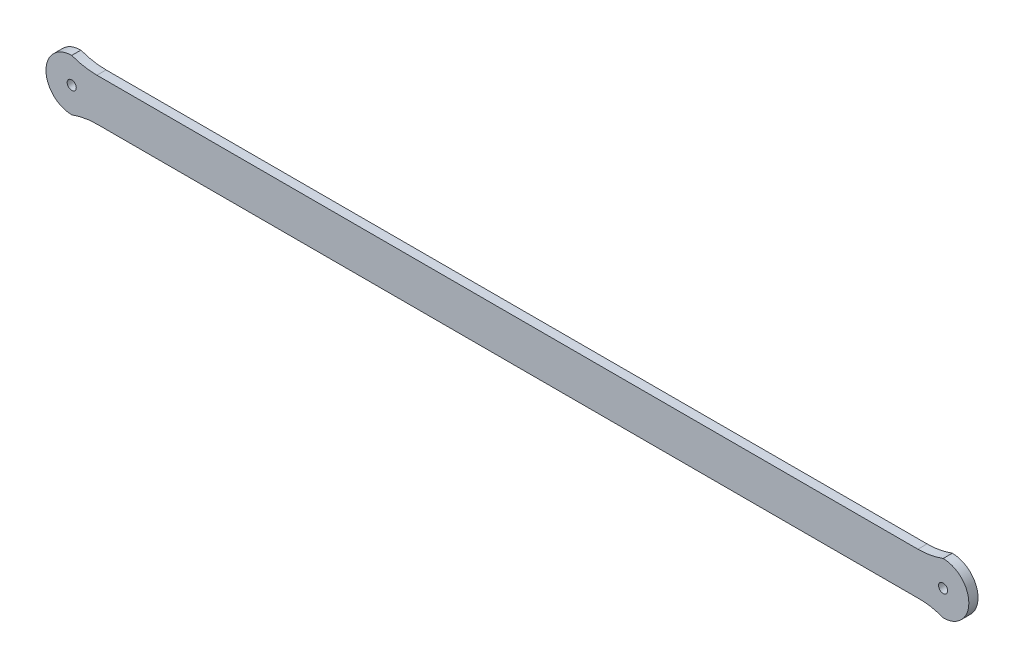
ISO-10303-21;
HEADER;
FILE_DESCRIPTION(('STEP AP214'),'2;1');
FILE_NAME('part.step','',(''),(''),'','','');
FILE_SCHEMA(('AUTOMOTIVE_DESIGN { 1 0 10303 214 1 1 1 1 }'));
ENDSEC;
DATA;
#1=APPLICATION_CONTEXT('core data for automotive mechanical design processes');
#2=APPLICATION_PROTOCOL_DEFINITION('international standard','automotive_design',2000,#1);
#3=PRODUCT_CONTEXT('',#1,'mechanical');
#4=PRODUCT('Part','Part','',(#3));
#5=PRODUCT_RELATED_PRODUCT_CATEGORY('part','',(#4));
#6=PRODUCT_DEFINITION_FORMATION('','',#4);
#7=PRODUCT_DEFINITION_CONTEXT('part definition',#1,'design');
#8=PRODUCT_DEFINITION('design','',#6,#7);
#9=PRODUCT_DEFINITION_SHAPE('','',#8);
#10=(LENGTH_UNIT() NAMED_UNIT(*) SI_UNIT(.MILLI.,.METRE.));
#11=(NAMED_UNIT(*) PLANE_ANGLE_UNIT() SI_UNIT($,.RADIAN.));
#12=(NAMED_UNIT(*) SI_UNIT($,.STERADIAN.) SOLID_ANGLE_UNIT());
#13=UNCERTAINTY_MEASURE_WITH_UNIT(LENGTH_MEASURE(1.E-05),#10,'distance_accuracy_value','');
#14=(GEOMETRIC_REPRESENTATION_CONTEXT(3) GLOBAL_UNCERTAINTY_ASSIGNED_CONTEXT((#13)) GLOBAL_UNIT_ASSIGNED_CONTEXT((#10,
#11,#12)) REPRESENTATION_CONTEXT('',''));
#15=CARTESIAN_POINT('',(0.,0.,0.));
#16=DIRECTION('',(0.,0.,1.));
#17=DIRECTION('',(1.,0.,0.));
#18=AXIS2_PLACEMENT_3D('',#15,#16,#17);
#19=CARTESIAN_POINT('',(-143.274111577399,32.5440909398075,1.6));
#20=DIRECTION('',(0.,0.,1.));
#21=DIRECTION('',(1.,0.,0.));
#22=AXIS2_PLACEMENT_3D('',#19,#20,#21);
#23=PLANE('',#22);
#24=CARTESIAN_POINT('',(-152.069999984504,8.58315293839063E-08,1.6));
#25=DIRECTION('',(0.,0.,1.));
#26=DIRECTION('',(1.,0.,0.));
#27=AXIS2_PLACEMENT_3D('',#24,#25,#26);
#28=CIRCLE('',#27,1.58750000000007);
#29=CARTESIAN_POINT('',(-150.482499984504,8.58315293839063E-08,1.6));
#30=VERTEX_POINT('',#29);
#31=EDGE_CURVE('E134',#30,#30,#28,.T.);
#32=ORIENTED_EDGE('',*,*,#31,.F.);
#33=EDGE_LOOP('',(#32));
#34=FACE_BOUND('',#33,.T.);
#35=CARTESIAN_POINT('',(-143.274111577399,32.5440909398075,1.6));
#36=DIRECTION('',(0.,0.,-1.));
#37=DIRECTION('',(1.,0.,0.));
#38=AXIS2_PLACEMENT_3D('',#35,#36,#37);
#39=CIRCLE('',#38,25.1540909398073);
#40=CARTESIAN_POINT('',(-143.274111577399,7.39000000000023,1.6));
#41=VERTEX_POINT('',#40);
#42=CARTESIAN_POINT('',(-152.069999984504,8.97800008583146,1.6));
#43=VERTEX_POINT('',#42);
#44=EDGE_CURVE('E145',#41,#43,#39,.T.);
#45=ORIENTED_EDGE('',*,*,#44,.T.);
#46=CARTESIAN_POINT('',(-152.069999984504,8.58315293839063E-08,1.6));
#47=DIRECTION('',(0.,0.,1.));
#48=DIRECTION('',(1.,0.,0.));
#49=AXIS2_PLACEMENT_3D('',#46,#47,#48);
#50=CIRCLE('',#49,8.97799999999993);
#51=CARTESIAN_POINT('',(-152.069999984504,-8.9779999141684,1.6));
#52=VERTEX_POINT('',#51);
#53=EDGE_CURVE('E93',#43,#52,#50,.T.);
#54=ORIENTED_EDGE('',*,*,#53,.T.);
#55=CARTESIAN_POINT('',(-143.129474357892,-33.3454246389378,1.6));
#56=DIRECTION('',(0.,0.,-1.));
#57=DIRECTION('',(1.,0.,0.));
#58=AXIS2_PLACEMENT_3D('',#55,#56,#57);
#59=CIRCLE('',#58,25.955816037979);
#60=CARTESIAN_POINT('',(-143.271999984546,-7.3899999141687,1.6));
#61=VERTEX_POINT('',#60);
#62=EDGE_CURVE('E160',#52,#61,#59,.T.);
#63=ORIENTED_EDGE('',*,*,#62,.T.);
#64=DIRECTION('',(1.,0.,0.));
#65=VECTOR('',#64,1.);
#66=CARTESIAN_POINT('',(-143.271999984546,-7.3899999141687,1.6));
#67=LINE('',#66,#65);
#68=CARTESIAN_POINT('',(143.272000015534,-7.38999991416865,1.6));
#69=VERTEX_POINT('',#68);
#70=EDGE_CURVE('E173',#61,#69,#67,.T.);
#71=ORIENTED_EDGE('',*,*,#70,.T.);
#72=CARTESIAN_POINT('',(143.960788719553,-28.7396919681472,1.6));
#73=DIRECTION('',(0.,0.,-1.));
#74=DIRECTION('',(1.,0.,0.));
#75=AXIS2_PLACEMENT_3D('',#72,#73,#74);
#76=CIRCLE('',#75,21.3608000945307);
#77=CARTESIAN_POINT('',(152.070000015496,-8.97799991416962,1.6));
#78=VERTEX_POINT('',#77);
#79=EDGE_CURVE('E112',#69,#78,#76,.T.);
#80=ORIENTED_EDGE('',*,*,#79,.T.);
#81=CARTESIAN_POINT('',(152.070003173006,4.29148279412761E-08,1.6));
#82=DIRECTION('',(0.,0.,1.));
#83=DIRECTION('',(1.,0.,0.));
#84=AXIS2_PLACEMENT_3D('',#81,#82,#83);
#85=CIRCLE('',#84,8.977999957085);
#86=CARTESIAN_POINT('',(152.070006330516,8.97799999999927,1.6));
#87=VERTEX_POINT('',#86);
#88=EDGE_CURVE('E106',#78,#87,#85,.T.);
#89=ORIENTED_EDGE('',*,*,#88,.T.);
#90=CARTESIAN_POINT('',(143.24673311969,32.6957759985154,1.6));
#91=DIRECTION('',(0.,0.,-1.));
#92=DIRECTION('',(1.,0.,0.));
#93=AXIS2_PLACEMENT_3D('',#90,#91,#92);
#94=CIRCLE('',#93,25.305790808996);
#95=CARTESIAN_POINT('',(143.274111608387,7.39000000000028,1.6));
#96=VERTEX_POINT('',#95);
#97=EDGE_CURVE('E110',#87,#96,#94,.T.);
#98=ORIENTED_EDGE('',*,*,#97,.T.);
#99=DIRECTION('',(-1.,0.,0.));
#100=VECTOR('',#99,1.);
#101=CARTESIAN_POINT('',(-143.274111577399,7.39000000000023,1.6));
#102=LINE('',#101,#100);
#103=EDGE_CURVE('E50',#96,#41,#102,.T.);
#104=ORIENTED_EDGE('',*,*,#103,.T.);
#105=EDGE_LOOP('',(#45,#54,#63,#71,#80,#89,#98,#104));
#106=FACE_BOUND('',#105,.T.);
#107=CARTESIAN_POINT('',(152.070003173006,4.29148279412761E-08,1.6));
#108=DIRECTION('',(0.,0.,1.));
#109=DIRECTION('',(1.,0.,0.));
#110=AXIS2_PLACEMENT_3D('',#107,#108,#109);
#111=CIRCLE('',#110,1.58749999999984);
#112=CARTESIAN_POINT('',(153.657503173006,4.29148279412761E-08,1.6));
#113=VERTEX_POINT('',#112);
#114=EDGE_CURVE('E182',#113,#113,#111,.T.);
#115=ORIENTED_EDGE('',*,*,#114,.F.);
#116=EDGE_LOOP('',(#115));
#117=FACE_BOUND('',#116,.T.);
#118=ADVANCED_FACE('F33',(#34,#106,#117),#23,.T.);
#119=CARTESIAN_POINT('',(-143.274111577399,32.5440909398075,-1.6));
#120=DIRECTION('',(0.,0.,1.));
#121=DIRECTION('',(1.,0.,0.));
#122=AXIS2_PLACEMENT_3D('',#119,#120,#121);
#123=PLANE('',#122);
#124=CARTESIAN_POINT('',(-143.274111577399,32.5440909398075,-1.6));
#125=DIRECTION('',(0.,0.,-1.));
#126=DIRECTION('',(1.,0.,0.));
#127=AXIS2_PLACEMENT_3D('',#124,#125,#126);
#128=CIRCLE('',#127,25.1540909398073);
#129=CARTESIAN_POINT('',(-143.274111577399,7.39000000000023,-1.6));
#130=VERTEX_POINT('',#129);
#131=CARTESIAN_POINT('',(-152.069999984504,8.97800008583146,-1.6));
#132=VERTEX_POINT('',#131);
#133=EDGE_CURVE('E130',#130,#132,#128,.T.);
#134=ORIENTED_EDGE('',*,*,#133,.F.);
#135=DIRECTION('',(-1.,0.,0.));
#136=VECTOR('',#135,1.);
#137=CARTESIAN_POINT('',(-143.274111577399,7.39000000000023,-1.6));
#138=LINE('',#137,#136);
#139=CARTESIAN_POINT('',(143.274111608387,7.39000000000028,-1.6));
#140=VERTEX_POINT('',#139);
#141=EDGE_CURVE('E85',#140,#130,#138,.T.);
#142=ORIENTED_EDGE('',*,*,#141,.F.);
#143=CARTESIAN_POINT('',(143.24673311969,32.6957759985154,-1.6));
#144=DIRECTION('',(0.,0.,-1.));
#145=DIRECTION('',(1.,0.,0.));
#146=AXIS2_PLACEMENT_3D('',#143,#144,#145);
#147=CIRCLE('',#146,25.305790808996);
#148=CARTESIAN_POINT('',(152.070006330516,8.97799999999927,-1.6));
#149=VERTEX_POINT('',#148);
#150=EDGE_CURVE('E79',#149,#140,#147,.T.);
#151=ORIENTED_EDGE('',*,*,#150,.F.);
#152=CARTESIAN_POINT('',(152.070003173006,4.29148279412761E-08,-1.6));
#153=DIRECTION('',(0.,0.,1.));
#154=DIRECTION('',(1.,0.,0.));
#155=AXIS2_PLACEMENT_3D('',#152,#153,#154);
#156=CIRCLE('',#155,8.977999957085);
#157=CARTESIAN_POINT('',(152.070000015496,-8.97799991416962,-1.6));
#158=VERTEX_POINT('',#157);
#159=EDGE_CURVE('E120',#158,#149,#156,.T.);
#160=ORIENTED_EDGE('',*,*,#159,.F.);
#161=CARTESIAN_POINT('',(143.960788719553,-28.7396919681472,-1.6));
#162=DIRECTION('',(0.,0.,-1.));
#163=DIRECTION('',(1.,0.,0.));
#164=AXIS2_PLACEMENT_3D('',#161,#162,#163);
#165=CIRCLE('',#164,21.3608000945307);
#166=CARTESIAN_POINT('',(143.272000015534,-7.38999991416865,-1.6));
#167=VERTEX_POINT('',#166);
#168=EDGE_CURVE('E140',#167,#158,#165,.T.);
#169=ORIENTED_EDGE('',*,*,#168,.F.);
#170=DIRECTION('',(1.,0.,0.));
#171=VECTOR('',#170,1.);
#172=CARTESIAN_POINT('',(-143.271999984546,-7.3899999141687,-1.6));
#173=LINE('',#172,#171);
#174=CARTESIAN_POINT('',(-143.271999984546,-7.3899999141687,-1.6));
#175=VERTEX_POINT('',#174);
#176=EDGE_CURVE('E138',#175,#167,#173,.T.);
#177=ORIENTED_EDGE('',*,*,#176,.F.);
#178=CARTESIAN_POINT('',(-143.129474357892,-33.3454246389378,-1.6));
#179=DIRECTION('',(0.,0.,-1.));
#180=DIRECTION('',(1.,0.,0.));
#181=AXIS2_PLACEMENT_3D('',#178,#179,#180);
#182=CIRCLE('',#181,25.955816037979);
#183=CARTESIAN_POINT('',(-152.069999984504,-8.9779999141684,-1.6));
#184=VERTEX_POINT('',#183);
#185=EDGE_CURVE('E136',#184,#175,#182,.T.);
#186=ORIENTED_EDGE('',*,*,#185,.F.);
#187=CARTESIAN_POINT('',(-152.069999984504,8.58315293839063E-08,-1.6));
#188=DIRECTION('',(0.,0.,1.));
#189=DIRECTION('',(1.,0.,0.));
#190=AXIS2_PLACEMENT_3D('',#187,#188,#189);
#191=CIRCLE('',#190,8.97799999999993);
#192=EDGE_CURVE('E133',#132,#184,#191,.T.);
#193=ORIENTED_EDGE('',*,*,#192,.F.);
#194=EDGE_LOOP('',(#134,#142,#151,#160,#169,#177,#186,#193));
#195=FACE_BOUND('',#194,.T.);
#196=CARTESIAN_POINT('',(-152.069999984504,8.58315293839063E-08,-1.6));
#197=DIRECTION('',(0.,0.,1.));
#198=DIRECTION('',(1.,0.,0.));
#199=AXIS2_PLACEMENT_3D('',#196,#197,#198);
#200=CIRCLE('',#199,1.58750000000007);
#201=CARTESIAN_POINT('',(-150.482499984504,8.58315293839063E-08,-1.6));
#202=VERTEX_POINT('',#201);
#203=EDGE_CURVE('E179',#202,#202,#200,.T.);
#204=ORIENTED_EDGE('',*,*,#203,.T.);
#205=EDGE_LOOP('',(#204));
#206=FACE_BOUND('',#205,.T.);
#207=CARTESIAN_POINT('',(152.070003173006,4.29148279412761E-08,-1.6));
#208=DIRECTION('',(0.,0.,1.));
#209=DIRECTION('',(1.,0.,0.));
#210=AXIS2_PLACEMENT_3D('',#207,#208,#209);
#211=CIRCLE('',#210,1.58749999999984);
#212=CARTESIAN_POINT('',(153.657503173006,4.29148279412761E-08,-1.6));
#213=VERTEX_POINT('',#212);
#214=EDGE_CURVE('E185',#213,#213,#211,.T.);
#215=ORIENTED_EDGE('',*,*,#214,.T.);
#216=EDGE_LOOP('',(#215));
#217=FACE_BOUND('',#216,.T.);
#218=ADVANCED_FACE('F164',(#195,#206,#217),#123,.F.);
#219=CARTESIAN_POINT('',(-143.274111577399,32.5440909398075,1.6));
#220=DIRECTION('',(0.,0.,-1.));
#221=DIRECTION('',(-1.,0.,0.));
#222=AXIS2_PLACEMENT_3D('',#219,#220,#221);
#223=CYLINDRICAL_SURFACE('',#222,25.1540909398073);
#224=ORIENTED_EDGE('',*,*,#133,.T.);
#225=DIRECTION('',(0.,0.,-1.));
#226=VECTOR('',#225,1.);
#227=CARTESIAN_POINT('',(-152.069999984504,8.97800008583146,1.6));
#228=LINE('',#227,#226);
#229=EDGE_CURVE('E11',#43,#132,#228,.T.);
#230=ORIENTED_EDGE('',*,*,#229,.F.);
#231=ORIENTED_EDGE('',*,*,#44,.F.);
#232=DIRECTION('',(0.,0.,-1.));
#233=VECTOR('',#232,1.);
#234=CARTESIAN_POINT('',(-143.274111577399,7.39000000000023,1.6));
#235=LINE('',#234,#233);
#236=EDGE_CURVE('E126',#41,#130,#235,.T.);
#237=ORIENTED_EDGE('',*,*,#236,.T.);
#238=EDGE_LOOP('',(#224,#230,#231,#237));
#239=FACE_BOUND('',#238,.T.);
#240=ADVANCED_FACE('F35',(#239),#223,.F.);
#241=CARTESIAN_POINT('',(-152.069999984504,8.58315293839063E-08,1.6));
#242=DIRECTION('',(0.,0.,-1.));
#243=DIRECTION('',(-1.,0.,0.));
#244=AXIS2_PLACEMENT_3D('',#241,#242,#243);
#245=CYLINDRICAL_SURFACE('',#244,8.97799999999993);
#246=ORIENTED_EDGE('',*,*,#192,.T.);
#247=DIRECTION('',(0.,0.,-1.));
#248=VECTOR('',#247,1.);
#249=CARTESIAN_POINT('',(-152.069999984504,-8.9779999141684,1.6));
#250=LINE('',#249,#248);
#251=EDGE_CURVE('E42',#52,#184,#250,.T.);
#252=ORIENTED_EDGE('',*,*,#251,.F.);
#253=ORIENTED_EDGE('',*,*,#53,.F.);
#254=ORIENTED_EDGE('',*,*,#229,.T.);
#255=EDGE_LOOP('',(#246,#252,#253,#254));
#256=FACE_BOUND('',#255,.T.);
#257=ADVANCED_FACE('F217',(#256),#245,.T.);
#258=CARTESIAN_POINT('',(-143.129474357892,-33.3454246389378,1.6));
#259=DIRECTION('',(0.,0.,-1.));
#260=DIRECTION('',(-1.,0.,0.));
#261=AXIS2_PLACEMENT_3D('',#258,#259,#260);
#262=CYLINDRICAL_SURFACE('',#261,25.955816037979);
#263=ORIENTED_EDGE('',*,*,#185,.T.);
#264=DIRECTION('',(0.,0.,-1.));
#265=VECTOR('',#264,1.);
#266=CARTESIAN_POINT('',(-143.271999984546,-7.3899999141687,1.6));
#267=LINE('',#266,#265);
#268=EDGE_CURVE('E152',#61,#175,#267,.T.);
#269=ORIENTED_EDGE('',*,*,#268,.F.);
#270=ORIENTED_EDGE('',*,*,#62,.F.);
#271=ORIENTED_EDGE('',*,*,#251,.T.);
#272=EDGE_LOOP('',(#263,#269,#270,#271));
#273=FACE_BOUND('',#272,.T.);
#274=ADVANCED_FACE('F158',(#273),#262,.F.);
#275=CARTESIAN_POINT('',(-143.271999984546,-7.3899999141687,1.6));
#276=DIRECTION('',(0.,1.,0.));
#277=DIRECTION('',(-1.,0.,0.));
#278=AXIS2_PLACEMENT_3D('',#275,#276,#277);
#279=PLANE('',#278);
#280=ORIENTED_EDGE('',*,*,#176,.T.);
#281=DIRECTION('',(0.,0.,-1.));
#282=VECTOR('',#281,1.);
#283=CARTESIAN_POINT('',(143.272000015534,-7.38999991416865,1.6));
#284=LINE('',#283,#282);
#285=EDGE_CURVE('E149',#69,#167,#284,.T.);
#286=ORIENTED_EDGE('',*,*,#285,.F.);
#287=ORIENTED_EDGE('',*,*,#70,.F.);
#288=ORIENTED_EDGE('',*,*,#268,.T.);
#289=EDGE_LOOP('',(#280,#286,#287,#288));
#290=FACE_BOUND('',#289,.T.);
#291=ADVANCED_FACE('F169',(#290),#279,.F.);
#292=CARTESIAN_POINT('',(143.960788719553,-28.7396919681472,1.6));
#293=DIRECTION('',(0.,0.,-1.));
#294=DIRECTION('',(-1.,0.,0.));
#295=AXIS2_PLACEMENT_3D('',#292,#293,#294);
#296=CYLINDRICAL_SURFACE('',#295,21.3608000945307);
#297=ORIENTED_EDGE('',*,*,#168,.T.);
#298=DIRECTION('',(0.,0.,-1.));
#299=VECTOR('',#298,1.);
#300=CARTESIAN_POINT('',(152.070000015496,-8.97799991416962,1.6));
#301=LINE('',#300,#299);
#302=EDGE_CURVE('E121',#78,#158,#301,.T.);
#303=ORIENTED_EDGE('',*,*,#302,.F.);
#304=ORIENTED_EDGE('',*,*,#79,.F.);
#305=ORIENTED_EDGE('',*,*,#285,.T.);
#306=EDGE_LOOP('',(#297,#303,#304,#305));
#307=FACE_BOUND('',#306,.T.);
#308=ADVANCED_FACE('F172',(#307),#296,.F.);
#309=CARTESIAN_POINT('',(152.070003173006,4.29148279412761E-08,1.6));
#310=DIRECTION('',(0.,0.,-1.));
#311=DIRECTION('',(-1.,0.,0.));
#312=AXIS2_PLACEMENT_3D('',#309,#310,#311);
#313=CYLINDRICAL_SURFACE('',#312,8.977999957085);
#314=ORIENTED_EDGE('',*,*,#159,.T.);
#315=DIRECTION('',(0.,0.,-1.));
#316=VECTOR('',#315,1.);
#317=CARTESIAN_POINT('',(152.070006330516,8.97799999999927,1.6));
#318=LINE('',#317,#316);
#319=EDGE_CURVE('E117',#87,#149,#318,.T.);
#320=ORIENTED_EDGE('',*,*,#319,.F.);
#321=ORIENTED_EDGE('',*,*,#88,.F.);
#322=ORIENTED_EDGE('',*,*,#302,.T.);
#323=EDGE_LOOP('',(#314,#320,#321,#322));
#324=FACE_BOUND('',#323,.T.);
#325=ADVANCED_FACE('F118',(#324),#313,.T.);
#326=CARTESIAN_POINT('',(143.24673311969,32.6957759985154,1.6));
#327=DIRECTION('',(0.,0.,-1.));
#328=DIRECTION('',(-1.,0.,0.));
#329=AXIS2_PLACEMENT_3D('',#326,#327,#328);
#330=CYLINDRICAL_SURFACE('',#329,25.305790808996);
#331=ORIENTED_EDGE('',*,*,#150,.T.);
#332=DIRECTION('',(0.,0.,-1.));
#333=VECTOR('',#332,1.);
#334=CARTESIAN_POINT('',(143.274111608387,7.39000000000028,1.6));
#335=LINE('',#334,#333);
#336=EDGE_CURVE('E122',#96,#140,#335,.T.);
#337=ORIENTED_EDGE('',*,*,#336,.F.);
#338=ORIENTED_EDGE('',*,*,#97,.F.);
#339=ORIENTED_EDGE('',*,*,#319,.T.);
#340=EDGE_LOOP('',(#331,#337,#338,#339));
#341=FACE_BOUND('',#340,.T.);
#342=ADVANCED_FACE('F124',(#341),#330,.F.);
#343=CARTESIAN_POINT('',(-143.274111577399,7.39000000000023,1.6));
#344=DIRECTION('',(0.,-1.,0.));
#345=DIRECTION('',(1.,0.,0.));
#346=AXIS2_PLACEMENT_3D('',#343,#344,#345);
#347=PLANE('',#346);
#348=ORIENTED_EDGE('',*,*,#141,.T.);
#349=ORIENTED_EDGE('',*,*,#236,.F.);
#350=ORIENTED_EDGE('',*,*,#103,.F.);
#351=ORIENTED_EDGE('',*,*,#336,.T.);
#352=EDGE_LOOP('',(#348,#349,#350,#351));
#353=FACE_BOUND('',#352,.T.);
#354=ADVANCED_FACE('F205',(#353),#347,.F.);
#355=CARTESIAN_POINT('',(-152.069999984504,8.58315293839063E-08,1.6));
#356=DIRECTION('',(0.,0.,-1.));
#357=DIRECTION('',(-1.,0.,0.));
#358=AXIS2_PLACEMENT_3D('',#355,#356,#357);
#359=CYLINDRICAL_SURFACE('',#358,1.58750000000007);
#360=ORIENTED_EDGE('',*,*,#31,.T.);
#361=EDGE_LOOP('',(#360));
#362=FACE_BOUND('',#361,.T.);
#363=ORIENTED_EDGE('',*,*,#203,.F.);
#364=EDGE_LOOP('',(#363));
#365=FACE_BOUND('',#364,.T.);
#366=ADVANCED_FACE('F202',(#362,#365),#359,.F.);
#367=CARTESIAN_POINT('',(152.070003173006,4.29148279412761E-08,1.6));
#368=DIRECTION('',(0.,0.,-1.));
#369=DIRECTION('',(-1.,0.,0.));
#370=AXIS2_PLACEMENT_3D('',#367,#368,#369);
#371=CYLINDRICAL_SURFACE('',#370,1.58749999999984);
#372=ORIENTED_EDGE('',*,*,#114,.T.);
#373=EDGE_LOOP('',(#372));
#374=FACE_BOUND('',#373,.T.);
#375=ORIENTED_EDGE('',*,*,#214,.F.);
#376=EDGE_LOOP('',(#375));
#377=FACE_BOUND('',#376,.T.);
#378=ADVANCED_FACE('F191',(#374,#377),#371,.F.);
#379=CLOSED_SHELL('',(#118,#218,#240,#257,#274,#291,#308,#325,#342,#354,#366,#378));
#380=MANIFOLD_SOLID_BREP('B2',#379);
#381=ADVANCED_BREP_SHAPE_REPRESENTATION('',(#18,#380),#14);
#382=SHAPE_DEFINITION_REPRESENTATION(#9,#381);
ENDSEC;
END-ISO-10303-21;
